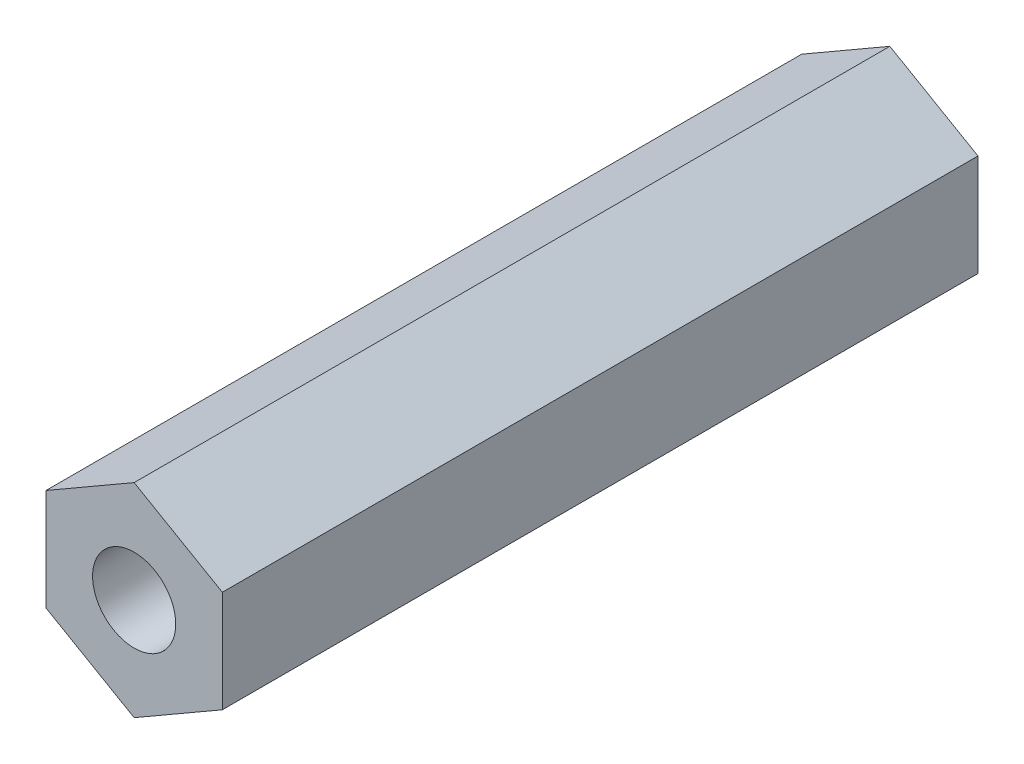
ISO-10303-21;
HEADER;
FILE_DESCRIPTION(('STEP AP214'),'2;1');
FILE_NAME('part.step','',(''),(''),'','','');
FILE_SCHEMA(('AUTOMOTIVE_DESIGN { 1 0 10303 214 1 1 1 1 }'));
ENDSEC;
DATA;
#1=APPLICATION_CONTEXT('core data for automotive mechanical design processes');
#2=APPLICATION_PROTOCOL_DEFINITION('international standard','automotive_design',2000,#1);
#3=PRODUCT_CONTEXT('',#1,'mechanical');
#4=PRODUCT('Part','Part','',(#3));
#5=PRODUCT_RELATED_PRODUCT_CATEGORY('part','',(#4));
#6=PRODUCT_DEFINITION_FORMATION('','',#4);
#7=PRODUCT_DEFINITION_CONTEXT('part definition',#1,'design');
#8=PRODUCT_DEFINITION('design','',#6,#7);
#9=PRODUCT_DEFINITION_SHAPE('','',#8);
#10=(LENGTH_UNIT() NAMED_UNIT(*) SI_UNIT(.MILLI.,.METRE.));
#11=(NAMED_UNIT(*) PLANE_ANGLE_UNIT() SI_UNIT($,.RADIAN.));
#12=(NAMED_UNIT(*) SI_UNIT($,.STERADIAN.) SOLID_ANGLE_UNIT());
#13=UNCERTAINTY_MEASURE_WITH_UNIT(LENGTH_MEASURE(1.E-05),#10,'distance_accuracy_value','');
#14=(GEOMETRIC_REPRESENTATION_CONTEXT(3) GLOBAL_UNCERTAINTY_ASSIGNED_CONTEXT((#13)) GLOBAL_UNIT_ASSIGNED_CONTEXT((#10,
#11,#12)) REPRESENTATION_CONTEXT('',''));
#15=CARTESIAN_POINT('',(0.,0.,0.));
#16=DIRECTION('',(0.,0.,1.));
#17=DIRECTION('',(1.,0.,0.));
#18=AXIS2_PLACEMENT_3D('',#15,#16,#17);
#19=CARTESIAN_POINT('',(0.,0.,30.));
#20=DIRECTION('',(0.,0.,1.));
#21=DIRECTION('',(1.,0.,0.));
#22=AXIS2_PLACEMENT_3D('',#19,#20,#21);
#23=PLANE('',#22);
#24=DIRECTION('',(0.,1.,0.));
#25=VECTOR('',#24,1.);
#26=CARTESIAN_POINT('',(3.5,-2.02072594216369,30.));
#27=LINE('',#26,#25);
#28=CARTESIAN_POINT('',(3.5,-2.02072594216369,30.));
#29=VERTEX_POINT('',#28);
#30=CARTESIAN_POINT('',(3.5,2.02072594216369,30.));
#31=VERTEX_POINT('',#30);
#32=EDGE_CURVE('E139',#29,#31,#27,.T.);
#33=ORIENTED_EDGE('',*,*,#32,.T.);
#34=DIRECTION('',(-0.866025403784439,0.5,0.));
#35=VECTOR('',#34,1.);
#36=CARTESIAN_POINT('',(3.5,2.02072594216369,30.));
#37=LINE('',#36,#35);
#38=CARTESIAN_POINT('',(0.,4.04145188432738,30.));
#39=VERTEX_POINT('',#38);
#40=EDGE_CURVE('E97',#31,#39,#37,.T.);
#41=ORIENTED_EDGE('',*,*,#40,.T.);
#42=DIRECTION('',(-0.866025403784439,-0.5,0.));
#43=VECTOR('',#42,1.);
#44=CARTESIAN_POINT('',(0.,4.04145188432738,30.));
#45=LINE('',#44,#43);
#46=CARTESIAN_POINT('',(-3.5,2.02072594216369,30.));
#47=VERTEX_POINT('',#46);
#48=EDGE_CURVE('E110',#39,#47,#45,.T.);
#49=ORIENTED_EDGE('',*,*,#48,.T.);
#50=DIRECTION('',(0.,-1.,0.));
#51=VECTOR('',#50,1.);
#52=CARTESIAN_POINT('',(-3.5,2.02072594216369,30.));
#53=LINE('',#52,#51);
#54=CARTESIAN_POINT('',(-3.5,-2.02072594216369,30.));
#55=VERTEX_POINT('',#54);
#56=EDGE_CURVE('E104',#47,#55,#53,.T.);
#57=ORIENTED_EDGE('',*,*,#56,.T.);
#58=DIRECTION('',(0.866025403784439,-0.5,0.));
#59=VECTOR('',#58,1.);
#60=CARTESIAN_POINT('',(-3.5,-2.02072594216369,30.));
#61=LINE('',#60,#59);
#62=CARTESIAN_POINT('',(0.,-4.04145188432738,30.));
#63=VERTEX_POINT('',#62);
#64=EDGE_CURVE('E108',#55,#63,#61,.T.);
#65=ORIENTED_EDGE('',*,*,#64,.T.);
#66=DIRECTION('',(0.866025403784439,0.5,0.));
#67=VECTOR('',#66,1.);
#68=CARTESIAN_POINT('',(0.,-4.04145188432738,30.));
#69=LINE('',#68,#67);
#70=EDGE_CURVE('E60',#63,#29,#69,.T.);
#71=ORIENTED_EDGE('',*,*,#70,.T.);
#72=EDGE_LOOP('',(#33,#41,#49,#57,#65,#71));
#73=FACE_BOUND('',#72,.T.);
#74=CARTESIAN_POINT('',(0.,0.,30.));
#75=DIRECTION('',(0.,0.,1.));
#76=DIRECTION('',(1.,0.,0.));
#77=AXIS2_PLACEMENT_3D('',#74,#75,#76);
#78=CIRCLE('',#77,1.65);
#79=CARTESIAN_POINT('',(1.65,0.,30.));
#80=VERTEX_POINT('',#79);
#81=EDGE_CURVE('E132',#80,#80,#78,.T.);
#82=ORIENTED_EDGE('',*,*,#81,.F.);
#83=EDGE_LOOP('',(#82));
#84=FACE_BOUND('',#83,.T.);
#85=ADVANCED_FACE('F43',(#73,#84),#23,.T.);
#86=CARTESIAN_POINT('',(0.,0.,0.));
#87=DIRECTION('',(0.,0.,1.));
#88=DIRECTION('',(1.,0.,0.));
#89=AXIS2_PLACEMENT_3D('',#86,#87,#88);
#90=PLANE('',#89);
#91=DIRECTION('',(0.,1.,0.));
#92=VECTOR('',#91,1.);
#93=CARTESIAN_POINT('',(3.5,-2.02072594216369,0.));
#94=LINE('',#93,#92);
#95=CARTESIAN_POINT('',(3.5,-2.02072594216369,0.));
#96=VERTEX_POINT('',#95);
#97=CARTESIAN_POINT('',(3.5,2.02072594216369,0.));
#98=VERTEX_POINT('',#97);
#99=EDGE_CURVE('E128',#96,#98,#94,.T.);
#100=ORIENTED_EDGE('',*,*,#99,.F.);
#101=DIRECTION('',(0.866025403784439,0.5,0.));
#102=VECTOR('',#101,1.);
#103=CARTESIAN_POINT('',(0.,-4.04145188432738,0.));
#104=LINE('',#103,#102);
#105=CARTESIAN_POINT('',(0.,-4.04145188432738,0.));
#106=VERTEX_POINT('',#105);
#107=EDGE_CURVE('E89',#106,#96,#104,.T.);
#108=ORIENTED_EDGE('',*,*,#107,.F.);
#109=DIRECTION('',(0.866025403784439,-0.5,0.));
#110=VECTOR('',#109,1.);
#111=CARTESIAN_POINT('',(-3.5,-2.02072594216369,0.));
#112=LINE('',#111,#110);
#113=CARTESIAN_POINT('',(-3.5,-2.02072594216369,0.));
#114=VERTEX_POINT('',#113);
#115=EDGE_CURVE('E83',#114,#106,#112,.T.);
#116=ORIENTED_EDGE('',*,*,#115,.F.);
#117=DIRECTION('',(0.,-1.,0.));
#118=VECTOR('',#117,1.);
#119=CARTESIAN_POINT('',(-3.5,2.02072594216369,0.));
#120=LINE('',#119,#118);
#121=CARTESIAN_POINT('',(-3.5,2.02072594216369,0.));
#122=VERTEX_POINT('',#121);
#123=EDGE_CURVE('E118',#122,#114,#120,.T.);
#124=ORIENTED_EDGE('',*,*,#123,.F.);
#125=DIRECTION('',(-0.866025403784439,-0.5,0.));
#126=VECTOR('',#125,1.);
#127=CARTESIAN_POINT('',(0.,4.04145188432738,0.));
#128=LINE('',#127,#126);
#129=CARTESIAN_POINT('',(0.,4.04145188432738,0.));
#130=VERTEX_POINT('',#129);
#131=EDGE_CURVE('E134',#130,#122,#128,.T.);
#132=ORIENTED_EDGE('',*,*,#131,.F.);
#133=DIRECTION('',(-0.866025403784439,0.5,0.));
#134=VECTOR('',#133,1.);
#135=CARTESIAN_POINT('',(3.5,2.02072594216369,0.));
#136=LINE('',#135,#134);
#137=EDGE_CURVE('E131',#98,#130,#136,.T.);
#138=ORIENTED_EDGE('',*,*,#137,.F.);
#139=EDGE_LOOP('',(#100,#108,#116,#124,#132,#138));
#140=FACE_BOUND('',#139,.T.);
#141=CARTESIAN_POINT('',(0.,0.,0.));
#142=DIRECTION('',(0.,0.,1.));
#143=DIRECTION('',(1.,0.,0.));
#144=AXIS2_PLACEMENT_3D('',#141,#142,#143);
#145=CIRCLE('',#144,1.65);
#146=CARTESIAN_POINT('',(1.65,0.,0.));
#147=VERTEX_POINT('',#146);
#148=EDGE_CURVE('E232',#147,#147,#145,.T.);
#149=ORIENTED_EDGE('',*,*,#148,.T.);
#150=EDGE_LOOP('',(#149));
#151=FACE_BOUND('',#150,.T.);
#152=ADVANCED_FACE('F148',(#140,#151),#90,.F.);
#153=CARTESIAN_POINT('',(3.5,-2.02072594216369,30.));
#154=DIRECTION('',(-1.,0.,0.));
#155=DIRECTION('',(0.,-1.,0.));
#156=AXIS2_PLACEMENT_3D('',#153,#154,#155);
#157=PLANE('',#156);
#158=ORIENTED_EDGE('',*,*,#99,.T.);
#159=DIRECTION('',(0.,0.,-1.));
#160=VECTOR('',#159,1.);
#161=CARTESIAN_POINT('',(3.5,2.02072594216369,30.));
#162=LINE('',#161,#160);
#163=EDGE_CURVE('E11',#31,#98,#162,.T.);
#164=ORIENTED_EDGE('',*,*,#163,.F.);
#165=ORIENTED_EDGE('',*,*,#32,.F.);
#166=DIRECTION('',(0.,0.,-1.));
#167=VECTOR('',#166,1.);
#168=CARTESIAN_POINT('',(3.5,-2.02072594216369,30.));
#169=LINE('',#168,#167);
#170=EDGE_CURVE('E124',#29,#96,#169,.T.);
#171=ORIENTED_EDGE('',*,*,#170,.T.);
#172=EDGE_LOOP('',(#158,#164,#165,#171));
#173=FACE_BOUND('',#172,.T.);
#174=ADVANCED_FACE('F45',(#173),#157,.F.);
#175=CARTESIAN_POINT('',(3.5,2.02072594216369,30.));
#176=DIRECTION('',(-0.5,-0.866025403784438,0.));
#177=DIRECTION('',(0.866025403784439,-0.5,0.));
#178=AXIS2_PLACEMENT_3D('',#175,#176,#177);
#179=PLANE('',#178);
#180=ORIENTED_EDGE('',*,*,#137,.T.);
#181=DIRECTION('',(0.,0.,-1.));
#182=VECTOR('',#181,1.);
#183=CARTESIAN_POINT('',(0.,4.04145188432738,30.));
#184=LINE('',#183,#182);
#185=EDGE_CURVE('E52',#39,#130,#184,.T.);
#186=ORIENTED_EDGE('',*,*,#185,.F.);
#187=ORIENTED_EDGE('',*,*,#40,.F.);
#188=ORIENTED_EDGE('',*,*,#163,.T.);
#189=EDGE_LOOP('',(#180,#186,#187,#188));
#190=FACE_BOUND('',#189,.T.);
#191=ADVANCED_FACE('F173',(#190),#179,.F.);
#192=CARTESIAN_POINT('',(0.,4.04145188432738,30.));
#193=DIRECTION('',(0.5,-0.866025403784439,0.));
#194=DIRECTION('',(0.866025403784439,0.5,0.));
#195=AXIS2_PLACEMENT_3D('',#192,#193,#194);
#196=PLANE('',#195);
#197=ORIENTED_EDGE('',*,*,#131,.T.);
#198=DIRECTION('',(0.,0.,-1.));
#199=VECTOR('',#198,1.);
#200=CARTESIAN_POINT('',(-3.5,2.02072594216369,30.));
#201=LINE('',#200,#199);
#202=EDGE_CURVE('E119',#47,#122,#201,.T.);
#203=ORIENTED_EDGE('',*,*,#202,.F.);
#204=ORIENTED_EDGE('',*,*,#48,.F.);
#205=ORIENTED_EDGE('',*,*,#185,.T.);
#206=EDGE_LOOP('',(#197,#203,#204,#205));
#207=FACE_BOUND('',#206,.T.);
#208=ADVANCED_FACE('F145',(#207),#196,.F.);
#209=CARTESIAN_POINT('',(-3.5,2.02072594216369,30.));
#210=DIRECTION('',(1.,0.,0.));
#211=DIRECTION('',(0.,1.,0.));
#212=AXIS2_PLACEMENT_3D('',#209,#210,#211);
#213=PLANE('',#212);
#214=ORIENTED_EDGE('',*,*,#123,.T.);
#215=DIRECTION('',(0.,0.,-1.));
#216=VECTOR('',#215,1.);
#217=CARTESIAN_POINT('',(-3.5,-2.02072594216369,30.));
#218=LINE('',#217,#216);
#219=EDGE_CURVE('E115',#55,#114,#218,.T.);
#220=ORIENTED_EDGE('',*,*,#219,.F.);
#221=ORIENTED_EDGE('',*,*,#56,.F.);
#222=ORIENTED_EDGE('',*,*,#202,.T.);
#223=EDGE_LOOP('',(#214,#220,#221,#222));
#224=FACE_BOUND('',#223,.T.);
#225=ADVANCED_FACE('F116',(#224),#213,.F.);
#226=CARTESIAN_POINT('',(-3.5,-2.02072594216369,30.));
#227=DIRECTION('',(0.5,0.866025403784439,0.));
#228=DIRECTION('',(-0.866025403784439,0.5,0.));
#229=AXIS2_PLACEMENT_3D('',#226,#227,#228);
#230=PLANE('',#229);
#231=ORIENTED_EDGE('',*,*,#115,.T.);
#232=DIRECTION('',(0.,0.,-1.));
#233=VECTOR('',#232,1.);
#234=CARTESIAN_POINT('',(0.,-4.04145188432738,30.));
#235=LINE('',#234,#233);
#236=EDGE_CURVE('E120',#63,#106,#235,.T.);
#237=ORIENTED_EDGE('',*,*,#236,.F.);
#238=ORIENTED_EDGE('',*,*,#64,.F.);
#239=ORIENTED_EDGE('',*,*,#219,.T.);
#240=EDGE_LOOP('',(#231,#237,#238,#239));
#241=FACE_BOUND('',#240,.T.);
#242=ADVANCED_FACE('F122',(#241),#230,.F.);
#243=CARTESIAN_POINT('',(0.,-4.04145188432738,30.));
#244=DIRECTION('',(-0.5,0.866025403784439,0.));
#245=DIRECTION('',(-0.866025403784439,-0.5,0.));
#246=AXIS2_PLACEMENT_3D('',#243,#244,#245);
#247=PLANE('',#246);
#248=ORIENTED_EDGE('',*,*,#107,.T.);
#249=ORIENTED_EDGE('',*,*,#170,.F.);
#250=ORIENTED_EDGE('',*,*,#70,.F.);
#251=ORIENTED_EDGE('',*,*,#236,.T.);
#252=EDGE_LOOP('',(#248,#249,#250,#251));
#253=FACE_BOUND('',#252,.T.);
#254=ADVANCED_FACE('F153',(#253),#247,.F.);
#255=CARTESIAN_POINT('',(0.,0.,30.));
#256=DIRECTION('',(0.,0.,-1.));
#257=DIRECTION('',(-1.,0.,0.));
#258=AXIS2_PLACEMENT_3D('',#255,#256,#257);
#259=CYLINDRICAL_SURFACE('',#258,1.65);
#260=ORIENTED_EDGE('',*,*,#81,.T.);
#261=EDGE_LOOP('',(#260));
#262=FACE_BOUND('',#261,.T.);
#263=ORIENTED_EDGE('',*,*,#148,.F.);
#264=EDGE_LOOP('',(#263));
#265=FACE_BOUND('',#264,.T.);
#266=ADVANCED_FACE('F155',(#262,#265),#259,.F.);
#267=CLOSED_SHELL('',(#85,#152,#174,#191,#208,#225,#242,#254,#266));
#268=MANIFOLD_SOLID_BREP('B2',#267);
#269=ADVANCED_BREP_SHAPE_REPRESENTATION('',(#18,#268),#14);
#270=SHAPE_DEFINITION_REPRESENTATION(#9,#269);
ENDSEC;
END-ISO-10303-21;
